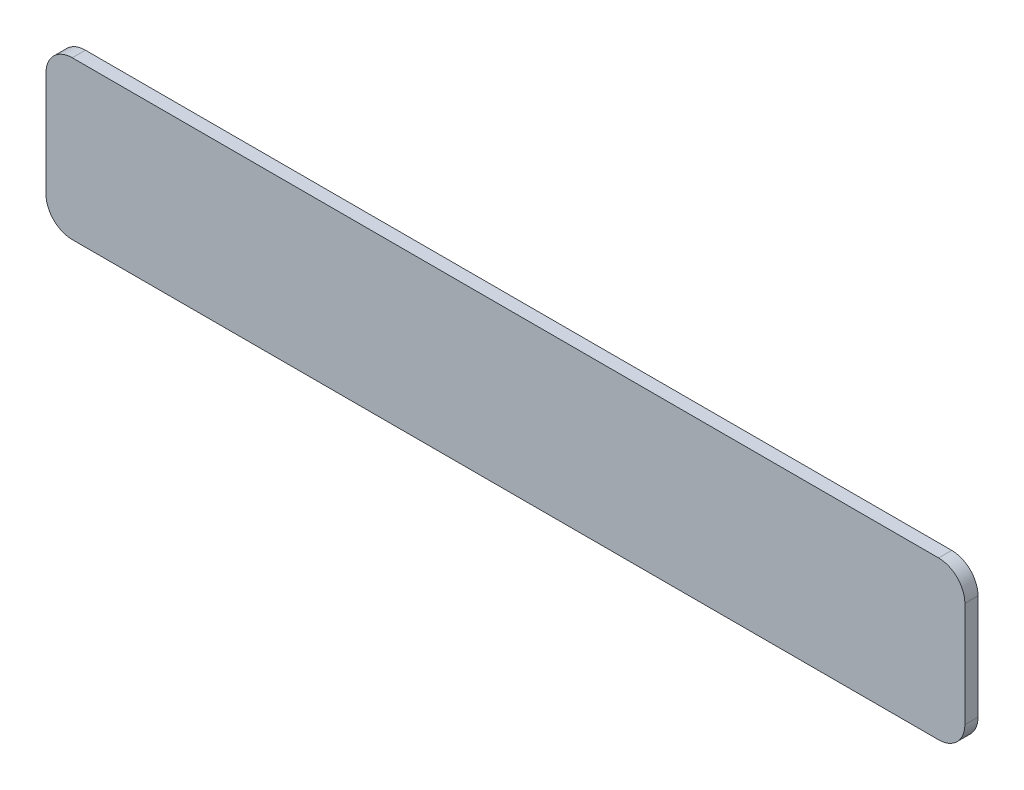
ISO-10303-21;
HEADER;
FILE_DESCRIPTION(('STEP AP214'),'2;1');
FILE_NAME('part.step','',(''),(''),'','','');
FILE_SCHEMA(('AUTOMOTIVE_DESIGN { 1 0 10303 214 1 1 1 1 }'));
ENDSEC;
DATA;
#1=APPLICATION_CONTEXT('core data for automotive mechanical design processes');
#2=APPLICATION_PROTOCOL_DEFINITION('international standard','automotive_design',2000,#1);
#3=PRODUCT_CONTEXT('',#1,'mechanical');
#4=PRODUCT('Part','Part','',(#3));
#5=PRODUCT_RELATED_PRODUCT_CATEGORY('part','',(#4));
#6=PRODUCT_DEFINITION_FORMATION('','',#4);
#7=PRODUCT_DEFINITION_CONTEXT('part definition',#1,'design');
#8=PRODUCT_DEFINITION('design','',#6,#7);
#9=PRODUCT_DEFINITION_SHAPE('','',#8);
#10=(LENGTH_UNIT() NAMED_UNIT(*) SI_UNIT(.MILLI.,.METRE.));
#11=(NAMED_UNIT(*) PLANE_ANGLE_UNIT() SI_UNIT($,.RADIAN.));
#12=(NAMED_UNIT(*) SI_UNIT($,.STERADIAN.) SOLID_ANGLE_UNIT());
#13=UNCERTAINTY_MEASURE_WITH_UNIT(LENGTH_MEASURE(1.E-05),#10,'distance_accuracy_value','');
#14=(GEOMETRIC_REPRESENTATION_CONTEXT(3) GLOBAL_UNCERTAINTY_ASSIGNED_CONTEXT((#13)) GLOBAL_UNIT_ASSIGNED_CONTEXT((#10,
#11,#12)) REPRESENTATION_CONTEXT('',''));
#15=CARTESIAN_POINT('',(0.,0.,0.));
#16=DIRECTION('',(0.,0.,1.));
#17=DIRECTION('',(1.,0.,0.));
#18=AXIS2_PLACEMENT_3D('',#15,#16,#17);
#19=CARTESIAN_POINT('',(33.,-4.,1.));
#20=DIRECTION('',(0.,0.,-1.));
#21=DIRECTION('',(-1.,0.,0.));
#22=AXIS2_PLACEMENT_3D('',#19,#20,#21);
#23=CYLINDRICAL_SURFACE('',#22,2.);
#24=CARTESIAN_POINT('',(33.,-4.,0.));
#25=DIRECTION('',(0.,0.,1.));
#26=DIRECTION('',(1.,0.,0.));
#27=AXIS2_PLACEMENT_3D('',#24,#25,#26);
#28=CIRCLE('',#27,2.);
#29=CARTESIAN_POINT('',(33.,-6.,0.));
#30=VERTEX_POINT('',#29);
#31=CARTESIAN_POINT('',(35.,-3.99999999999999,0.));
#32=VERTEX_POINT('',#31);
#33=EDGE_CURVE('E129',#30,#32,#28,.T.);
#34=ORIENTED_EDGE('',*,*,#33,.T.);
#35=DIRECTION('',(0.,0.,-1.));
#36=VECTOR('',#35,1.);
#37=CARTESIAN_POINT('',(35.,-3.99999999999999,1.));
#38=LINE('',#37,#36);
#39=CARTESIAN_POINT('',(35.,-3.99999999999999,1.));
#40=VERTEX_POINT('',#39);
#41=EDGE_CURVE('E11',#40,#32,#38,.T.);
#42=ORIENTED_EDGE('',*,*,#41,.F.);
#43=CARTESIAN_POINT('',(33.,-4.,1.));
#44=DIRECTION('',(0.,0.,1.));
#45=DIRECTION('',(1.,0.,0.));
#46=AXIS2_PLACEMENT_3D('',#43,#44,#45);
#47=CIRCLE('',#46,2.);
#48=CARTESIAN_POINT('',(33.,-6.,1.));
#49=VERTEX_POINT('',#48);
#50=EDGE_CURVE('E143',#49,#40,#47,.T.);
#51=ORIENTED_EDGE('',*,*,#50,.F.);
#52=DIRECTION('',(0.,0.,-1.));
#53=VECTOR('',#52,1.);
#54=CARTESIAN_POINT('',(33.,-6.,1.));
#55=LINE('',#54,#53);
#56=EDGE_CURVE('E125',#49,#30,#55,.T.);
#57=ORIENTED_EDGE('',*,*,#56,.T.);
#58=EDGE_LOOP('',(#34,#42,#51,#57));
#59=FACE_BOUND('',#58,.T.);
#60=ADVANCED_FACE('F33',(#59),#23,.T.);
#61=CARTESIAN_POINT('',(35.,-3.99999999999999,1.));
#62=DIRECTION('',(-1.,0.,0.));
#63=DIRECTION('',(0.,0.,1.));
#64=AXIS2_PLACEMENT_3D('',#61,#62,#63);
#65=PLANE('',#64);
#66=DIRECTION('',(0.,1.,0.));
#67=VECTOR('',#66,1.);
#68=CARTESIAN_POINT('',(35.,-3.99999999999999,0.));
#69=LINE('',#68,#67);
#70=CARTESIAN_POINT('',(35.,3.99999999999999,0.));
#71=VERTEX_POINT('',#70);
#72=EDGE_CURVE('E132',#32,#71,#69,.T.);
#73=ORIENTED_EDGE('',*,*,#72,.T.);
#74=DIRECTION('',(0.,0.,-1.));
#75=VECTOR('',#74,1.);
#76=CARTESIAN_POINT('',(35.,3.99999999999999,1.));
#77=LINE('',#76,#75);
#78=CARTESIAN_POINT('',(35.,3.99999999999999,1.));
#79=VERTEX_POINT('',#78);
#80=EDGE_CURVE('E41',#79,#71,#77,.T.);
#81=ORIENTED_EDGE('',*,*,#80,.F.);
#82=DIRECTION('',(0.,1.,0.));
#83=VECTOR('',#82,1.);
#84=CARTESIAN_POINT('',(35.,-3.99999999999999,1.));
#85=LINE('',#84,#83);
#86=EDGE_CURVE('E92',#40,#79,#85,.T.);
#87=ORIENTED_EDGE('',*,*,#86,.F.);
#88=ORIENTED_EDGE('',*,*,#41,.T.);
#89=EDGE_LOOP('',(#73,#81,#87,#88));
#90=FACE_BOUND('',#89,.T.);
#91=ADVANCED_FACE('F178',(#90),#65,.F.);
#92=CARTESIAN_POINT('',(33.,4.,1.));
#93=DIRECTION('',(0.,0.,-1.));
#94=DIRECTION('',(-1.,0.,0.));
#95=AXIS2_PLACEMENT_3D('',#92,#93,#94);
#96=CYLINDRICAL_SURFACE('',#95,2.);
#97=CARTESIAN_POINT('',(33.,4.,0.));
#98=DIRECTION('',(0.,0.,1.));
#99=DIRECTION('',(-1.,0.,0.));
#100=AXIS2_PLACEMENT_3D('',#97,#98,#99);
#101=CIRCLE('',#100,2.);
#102=CARTESIAN_POINT('',(33.,6.,0.));
#103=VERTEX_POINT('',#102);
#104=EDGE_CURVE('E134',#71,#103,#101,.T.);
#105=ORIENTED_EDGE('',*,*,#104,.T.);
#106=DIRECTION('',(0.,0.,-1.));
#107=VECTOR('',#106,1.);
#108=CARTESIAN_POINT('',(33.,6.,1.));
#109=LINE('',#108,#107);
#110=CARTESIAN_POINT('',(33.,6.,1.));
#111=VERTEX_POINT('',#110);
#112=EDGE_CURVE('E150',#111,#103,#109,.T.);
#113=ORIENTED_EDGE('',*,*,#112,.F.);
#114=CARTESIAN_POINT('',(33.,4.,1.));
#115=DIRECTION('',(0.,0.,1.));
#116=DIRECTION('',(-1.,0.,0.));
#117=AXIS2_PLACEMENT_3D('',#114,#115,#116);
#118=CIRCLE('',#117,2.);
#119=EDGE_CURVE('E158',#79,#111,#118,.T.);
#120=ORIENTED_EDGE('',*,*,#119,.F.);
#121=ORIENTED_EDGE('',*,*,#80,.T.);
#122=EDGE_LOOP('',(#105,#113,#120,#121));
#123=FACE_BOUND('',#122,.T.);
#124=ADVANCED_FACE('F156',(#123),#96,.T.);
#125=CARTESIAN_POINT('',(-33.,6.,1.));
#126=DIRECTION('',(0.,-1.,0.));
#127=DIRECTION('',(0.,0.,-1.));
#128=AXIS2_PLACEMENT_3D('',#125,#126,#127);
#129=PLANE('',#128);
#130=DIRECTION('',(-1.,0.,0.));
#131=VECTOR('',#130,1.);
#132=CARTESIAN_POINT('',(-33.,6.,0.));
#133=LINE('',#132,#131);
#134=CARTESIAN_POINT('',(-33.,6.,0.));
#135=VERTEX_POINT('',#134);
#136=EDGE_CURVE('E136',#103,#135,#133,.T.);
#137=ORIENTED_EDGE('',*,*,#136,.T.);
#138=DIRECTION('',(0.,0.,-1.));
#139=VECTOR('',#138,1.);
#140=CARTESIAN_POINT('',(-33.,6.,1.));
#141=LINE('',#140,#139);
#142=CARTESIAN_POINT('',(-33.,6.,1.));
#143=VERTEX_POINT('',#142);
#144=EDGE_CURVE('E147',#143,#135,#141,.T.);
#145=ORIENTED_EDGE('',*,*,#144,.F.);
#146=DIRECTION('',(-1.,0.,0.));
#147=VECTOR('',#146,1.);
#148=CARTESIAN_POINT('',(-33.,6.,1.));
#149=LINE('',#148,#147);
#150=EDGE_CURVE('E170',#111,#143,#149,.T.);
#151=ORIENTED_EDGE('',*,*,#150,.F.);
#152=ORIENTED_EDGE('',*,*,#112,.T.);
#153=EDGE_LOOP('',(#137,#145,#151,#152));
#154=FACE_BOUND('',#153,.T.);
#155=ADVANCED_FACE('F166',(#154),#129,.F.);
#156=CARTESIAN_POINT('',(-33.,4.,1.));
#157=DIRECTION('',(0.,0.,-1.));
#158=DIRECTION('',(-1.,0.,0.));
#159=AXIS2_PLACEMENT_3D('',#156,#157,#158);
#160=CYLINDRICAL_SURFACE('',#159,2.);
#161=CARTESIAN_POINT('',(-33.,4.,0.));
#162=DIRECTION('',(0.,0.,1.));
#163=DIRECTION('',(-1.,0.,0.));
#164=AXIS2_PLACEMENT_3D('',#161,#162,#163);
#165=CIRCLE('',#164,2.);
#166=CARTESIAN_POINT('',(-35.,3.99999999999998,0.));
#167=VERTEX_POINT('',#166);
#168=EDGE_CURVE('E138',#135,#167,#165,.T.);
#169=ORIENTED_EDGE('',*,*,#168,.T.);
#170=DIRECTION('',(0.,0.,-1.));
#171=VECTOR('',#170,1.);
#172=CARTESIAN_POINT('',(-35.,3.99999999999998,1.));
#173=LINE('',#172,#171);
#174=CARTESIAN_POINT('',(-35.,3.99999999999998,1.));
#175=VERTEX_POINT('',#174);
#176=EDGE_CURVE('E120',#175,#167,#173,.T.);
#177=ORIENTED_EDGE('',*,*,#176,.F.);
#178=CARTESIAN_POINT('',(-33.,4.,1.));
#179=DIRECTION('',(0.,0.,1.));
#180=DIRECTION('',(-1.,0.,0.));
#181=AXIS2_PLACEMENT_3D('',#178,#179,#180);
#182=CIRCLE('',#181,2.);
#183=EDGE_CURVE('E111',#143,#175,#182,.T.);
#184=ORIENTED_EDGE('',*,*,#183,.F.);
#185=ORIENTED_EDGE('',*,*,#144,.T.);
#186=EDGE_LOOP('',(#169,#177,#184,#185));
#187=FACE_BOUND('',#186,.T.);
#188=ADVANCED_FACE('F169',(#187),#160,.T.);
#189=CARTESIAN_POINT('',(-35.,-3.99999999999999,1.));
#190=DIRECTION('',(1.,0.,0.));
#191=DIRECTION('',(0.,0.,-1.));
#192=AXIS2_PLACEMENT_3D('',#189,#190,#191);
#193=PLANE('',#192);
#194=DIRECTION('',(0.,-1.,0.));
#195=VECTOR('',#194,1.);
#196=CARTESIAN_POINT('',(-35.,-3.99999999999999,0.));
#197=LINE('',#196,#195);
#198=CARTESIAN_POINT('',(-35.,-4.,0.));
#199=VERTEX_POINT('',#198);
#200=EDGE_CURVE('E119',#167,#199,#197,.T.);
#201=ORIENTED_EDGE('',*,*,#200,.T.);
#202=DIRECTION('',(0.,0.,-1.));
#203=VECTOR('',#202,1.);
#204=CARTESIAN_POINT('',(-35.,-4.,1.));
#205=LINE('',#204,#203);
#206=CARTESIAN_POINT('',(-35.,-4.,1.));
#207=VERTEX_POINT('',#206);
#208=EDGE_CURVE('E116',#207,#199,#205,.T.);
#209=ORIENTED_EDGE('',*,*,#208,.F.);
#210=DIRECTION('',(0.,-1.,0.));
#211=VECTOR('',#210,1.);
#212=CARTESIAN_POINT('',(-35.,-3.99999999999999,1.));
#213=LINE('',#212,#211);
#214=EDGE_CURVE('E105',#175,#207,#213,.T.);
#215=ORIENTED_EDGE('',*,*,#214,.F.);
#216=ORIENTED_EDGE('',*,*,#176,.T.);
#217=EDGE_LOOP('',(#201,#209,#215,#216));
#218=FACE_BOUND('',#217,.T.);
#219=ADVANCED_FACE('F117',(#218),#193,.F.);
#220=CARTESIAN_POINT('',(-33.,-4.,1.));
#221=DIRECTION('',(0.,0.,-1.));
#222=DIRECTION('',(-1.,0.,0.));
#223=AXIS2_PLACEMENT_3D('',#220,#221,#222);
#224=CYLINDRICAL_SURFACE('',#223,2.);
#225=CARTESIAN_POINT('',(-33.,-4.,0.));
#226=DIRECTION('',(0.,0.,1.));
#227=DIRECTION('',(-1.,0.,0.));
#228=AXIS2_PLACEMENT_3D('',#225,#226,#227);
#229=CIRCLE('',#228,2.);
#230=CARTESIAN_POINT('',(-33.,-6.,0.));
#231=VERTEX_POINT('',#230);
#232=EDGE_CURVE('E78',#199,#231,#229,.T.);
#233=ORIENTED_EDGE('',*,*,#232,.T.);
#234=DIRECTION('',(0.,0.,-1.));
#235=VECTOR('',#234,1.);
#236=CARTESIAN_POINT('',(-33.,-6.,1.));
#237=LINE('',#236,#235);
#238=CARTESIAN_POINT('',(-33.,-6.,1.));
#239=VERTEX_POINT('',#238);
#240=EDGE_CURVE('E121',#239,#231,#237,.T.);
#241=ORIENTED_EDGE('',*,*,#240,.F.);
#242=CARTESIAN_POINT('',(-33.,-4.,1.));
#243=DIRECTION('',(0.,0.,1.));
#244=DIRECTION('',(-1.,0.,0.));
#245=AXIS2_PLACEMENT_3D('',#242,#243,#244);
#246=CIRCLE('',#245,2.);
#247=EDGE_CURVE('E109',#207,#239,#246,.T.);
#248=ORIENTED_EDGE('',*,*,#247,.F.);
#249=ORIENTED_EDGE('',*,*,#208,.T.);
#250=EDGE_LOOP('',(#233,#241,#248,#249));
#251=FACE_BOUND('',#250,.T.);
#252=ADVANCED_FACE('F123',(#251),#224,.T.);
#253=CARTESIAN_POINT('',(-33.,-6.,1.));
#254=DIRECTION('',(0.,1.,0.));
#255=DIRECTION('',(0.,0.,1.));
#256=AXIS2_PLACEMENT_3D('',#253,#254,#255);
#257=PLANE('',#256);
#258=DIRECTION('',(1.,0.,0.));
#259=VECTOR('',#258,1.);
#260=CARTESIAN_POINT('',(-33.,-6.,0.));
#261=LINE('',#260,#259);
#262=EDGE_CURVE('E84',#231,#30,#261,.T.);
#263=ORIENTED_EDGE('',*,*,#262,.T.);
#264=ORIENTED_EDGE('',*,*,#56,.F.);
#265=DIRECTION('',(1.,0.,0.));
#266=VECTOR('',#265,1.);
#267=CARTESIAN_POINT('',(-33.,-6.,1.));
#268=LINE('',#267,#266);
#269=EDGE_CURVE('E49',#239,#49,#268,.T.);
#270=ORIENTED_EDGE('',*,*,#269,.F.);
#271=ORIENTED_EDGE('',*,*,#240,.T.);
#272=EDGE_LOOP('',(#263,#264,#270,#271));
#273=FACE_BOUND('',#272,.T.);
#274=ADVANCED_FACE('F194',(#273),#257,.F.);
#275=CARTESIAN_POINT('',(33.,-4.,1.));
#276=DIRECTION('',(0.,0.,1.));
#277=DIRECTION('',(1.,0.,0.));
#278=AXIS2_PLACEMENT_3D('',#275,#276,#277);
#279=PLANE('',#278);
#280=ORIENTED_EDGE('',*,*,#50,.T.);
#281=ORIENTED_EDGE('',*,*,#86,.T.);
#282=ORIENTED_EDGE('',*,*,#119,.T.);
#283=ORIENTED_EDGE('',*,*,#150,.T.);
#284=ORIENTED_EDGE('',*,*,#183,.T.);
#285=ORIENTED_EDGE('',*,*,#214,.T.);
#286=ORIENTED_EDGE('',*,*,#247,.T.);
#287=ORIENTED_EDGE('',*,*,#269,.T.);
#288=EDGE_LOOP('',(#280,#281,#282,#283,#284,#285,#286,#287));
#289=FACE_BOUND('',#288,.T.);
#290=ADVANCED_FACE('F107',(#289),#279,.T.);
#291=CARTESIAN_POINT('',(33.,-4.,0.));
#292=DIRECTION('',(0.,0.,1.));
#293=DIRECTION('',(1.,0.,0.));
#294=AXIS2_PLACEMENT_3D('',#291,#292,#293);
#295=PLANE('',#294);
#296=ORIENTED_EDGE('',*,*,#33,.F.);
#297=ORIENTED_EDGE('',*,*,#262,.F.);
#298=ORIENTED_EDGE('',*,*,#232,.F.);
#299=ORIENTED_EDGE('',*,*,#200,.F.);
#300=ORIENTED_EDGE('',*,*,#168,.F.);
#301=ORIENTED_EDGE('',*,*,#136,.F.);
#302=ORIENTED_EDGE('',*,*,#104,.F.);
#303=ORIENTED_EDGE('',*,*,#72,.F.);
#304=EDGE_LOOP('',(#296,#297,#298,#299,#300,#301,#302,#303));
#305=FACE_BOUND('',#304,.T.);
#306=ADVANCED_FACE('F162',(#305),#295,.F.);
#307=CLOSED_SHELL('',(#60,#91,#124,#155,#188,#219,#252,#274,#290,#306));
#308=MANIFOLD_SOLID_BREP('B2',#307);
#309=ADVANCED_BREP_SHAPE_REPRESENTATION('',(#18,#308),#14);
#310=SHAPE_DEFINITION_REPRESENTATION(#9,#309);
ENDSEC;
END-ISO-10303-21;
